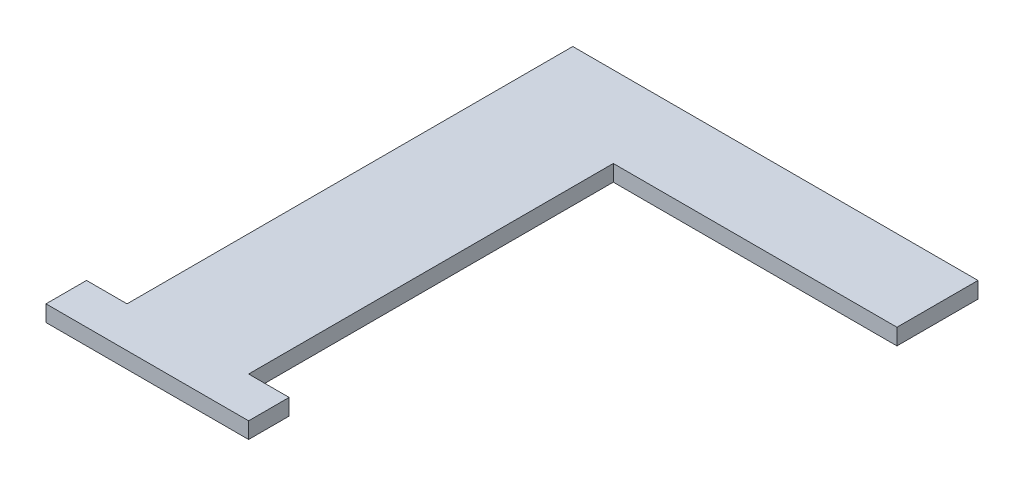
ISO-10303-21;
HEADER;
FILE_DESCRIPTION(('STEP AP214'),'2;1');
FILE_NAME('part.step','',(''),(''),'','','');
FILE_SCHEMA(('AUTOMOTIVE_DESIGN { 1 0 10303 214 1 1 1 1 }'));
ENDSEC;
DATA;
#1=APPLICATION_CONTEXT('core data for automotive mechanical design processes');
#2=APPLICATION_PROTOCOL_DEFINITION('international standard','automotive_design',2000,#1);
#3=PRODUCT_CONTEXT('',#1,'mechanical');
#4=PRODUCT('Part','Part','',(#3));
#5=PRODUCT_RELATED_PRODUCT_CATEGORY('part','',(#4));
#6=PRODUCT_DEFINITION_FORMATION('','',#4);
#7=PRODUCT_DEFINITION_CONTEXT('part definition',#1,'design');
#8=PRODUCT_DEFINITION('design','',#6,#7);
#9=PRODUCT_DEFINITION_SHAPE('','',#8);
#10=(LENGTH_UNIT() NAMED_UNIT(*) SI_UNIT(.MILLI.,.METRE.));
#11=(NAMED_UNIT(*) PLANE_ANGLE_UNIT() SI_UNIT($,.RADIAN.));
#12=(NAMED_UNIT(*) SI_UNIT($,.STERADIAN.) SOLID_ANGLE_UNIT());
#13=UNCERTAINTY_MEASURE_WITH_UNIT(LENGTH_MEASURE(1.E-05),#10,'distance_accuracy_value','');
#14=(GEOMETRIC_REPRESENTATION_CONTEXT(3) GLOBAL_UNCERTAINTY_ASSIGNED_CONTEXT((#13)) GLOBAL_UNIT_ASSIGNED_CONTEXT((#10,
#11,#12)) REPRESENTATION_CONTEXT('',''));
#15=CARTESIAN_POINT('',(0.,0.,0.));
#16=DIRECTION('',(0.,0.,1.));
#17=DIRECTION('',(1.,0.,0.));
#18=AXIS2_PLACEMENT_3D('',#15,#16,#17);
#19=CARTESIAN_POINT('',(0.,2.,10.));
#20=DIRECTION('',(-1.,0.,0.));
#21=DIRECTION('',(0.,0.,1.));
#22=AXIS2_PLACEMENT_3D('',#19,#20,#21);
#23=PLANE('',#22);
#24=DIRECTION('',(0.,0.,-1.));
#25=VECTOR('',#24,1.);
#26=CARTESIAN_POINT('',(0.,0.,10.));
#27=LINE('',#26,#25);
#28=CARTESIAN_POINT('',(0.,0.,10.));
#29=VERTEX_POINT('',#28);
#30=CARTESIAN_POINT('',(0.,0.,0.));
#31=VERTEX_POINT('',#30);
#32=EDGE_CURVE('E152',#29,#31,#27,.T.);
#33=ORIENTED_EDGE('',*,*,#32,.T.);
#34=DIRECTION('',(0.,-1.,0.));
#35=VECTOR('',#34,1.);
#36=CARTESIAN_POINT('',(0.,2.,0.));
#37=LINE('',#36,#35);
#38=CARTESIAN_POINT('',(0.,2.,0.));
#39=VERTEX_POINT('',#38);
#40=EDGE_CURVE('E11',#39,#31,#37,.T.);
#41=ORIENTED_EDGE('',*,*,#40,.F.);
#42=DIRECTION('',(0.,0.,-1.));
#43=VECTOR('',#42,1.);
#44=CARTESIAN_POINT('',(0.,2.,10.));
#45=LINE('',#44,#43);
#46=CARTESIAN_POINT('',(0.,2.,10.));
#47=VERTEX_POINT('',#46);
#48=EDGE_CURVE('E181',#47,#39,#45,.T.);
#49=ORIENTED_EDGE('',*,*,#48,.F.);
#50=DIRECTION('',(0.,-1.,0.));
#51=VECTOR('',#50,1.);
#52=CARTESIAN_POINT('',(0.,2.,10.));
#53=LINE('',#52,#51);
#54=EDGE_CURVE('E148',#47,#29,#53,.T.);
#55=ORIENTED_EDGE('',*,*,#54,.T.);
#56=EDGE_LOOP('',(#33,#41,#49,#55));
#57=FACE_BOUND('',#56,.T.);
#58=ADVANCED_FACE('F39',(#57),#23,.F.);
#59=CARTESIAN_POINT('',(0.,2.,0.));
#60=DIRECTION('',(0.,0.,1.));
#61=DIRECTION('',(1.,0.,0.));
#62=AXIS2_PLACEMENT_3D('',#59,#60,#61);
#63=PLANE('',#62);
#64=DIRECTION('',(-1.,0.,0.));
#65=VECTOR('',#64,1.);
#66=CARTESIAN_POINT('',(0.,0.,0.));
#67=LINE('',#66,#65);
#68=CARTESIAN_POINT('',(-50.,0.,0.));
#69=VERTEX_POINT('',#68);
#70=EDGE_CURVE('E156',#31,#69,#67,.T.);
#71=ORIENTED_EDGE('',*,*,#70,.T.);
#72=DIRECTION('',(0.,-1.,0.));
#73=VECTOR('',#72,1.);
#74=CARTESIAN_POINT('',(-50.,2.,0.));
#75=LINE('',#74,#73);
#76=CARTESIAN_POINT('',(-50.,2.,0.));
#77=VERTEX_POINT('',#76);
#78=EDGE_CURVE('E48',#77,#69,#75,.T.);
#79=ORIENTED_EDGE('',*,*,#78,.F.);
#80=DIRECTION('',(-1.,0.,0.));
#81=VECTOR('',#80,1.);
#82=CARTESIAN_POINT('',(0.,2.,0.));
#83=LINE('',#82,#81);
#84=EDGE_CURVE('E105',#39,#77,#83,.T.);
#85=ORIENTED_EDGE('',*,*,#84,.F.);
#86=ORIENTED_EDGE('',*,*,#40,.T.);
#87=EDGE_LOOP('',(#71,#79,#85,#86));
#88=FACE_BOUND('',#87,.T.);
#89=ADVANCED_FACE('F244',(#88),#63,.F.);
#90=CARTESIAN_POINT('',(-50.,2.,0.));
#91=DIRECTION('',(1.,0.,0.));
#92=DIRECTION('',(0.,0.,-1.));
#93=AXIS2_PLACEMENT_3D('',#90,#91,#92);
#94=PLANE('',#93);
#95=DIRECTION('',(0.,0.,1.));
#96=VECTOR('',#95,1.);
#97=CARTESIAN_POINT('',(-50.,0.,0.));
#98=LINE('',#97,#96);
#99=CARTESIAN_POINT('',(-50.,0.,55.));
#100=VERTEX_POINT('',#99);
#101=EDGE_CURVE('E159',#69,#100,#98,.T.);
#102=ORIENTED_EDGE('',*,*,#101,.T.);
#103=DIRECTION('',(0.,-1.,0.));
#104=VECTOR('',#103,1.);
#105=CARTESIAN_POINT('',(-50.,2.,55.));
#106=LINE('',#105,#104);
#107=CARTESIAN_POINT('',(-50.,2.,55.));
#108=VERTEX_POINT('',#107);
#109=EDGE_CURVE('E200',#108,#100,#106,.T.);
#110=ORIENTED_EDGE('',*,*,#109,.F.);
#111=DIRECTION('',(0.,0.,1.));
#112=VECTOR('',#111,1.);
#113=CARTESIAN_POINT('',(-50.,2.,0.));
#114=LINE('',#113,#112);
#115=EDGE_CURVE('E210',#77,#108,#114,.T.);
#116=ORIENTED_EDGE('',*,*,#115,.F.);
#117=ORIENTED_EDGE('',*,*,#78,.T.);
#118=EDGE_LOOP('',(#102,#110,#116,#117));
#119=FACE_BOUND('',#118,.T.);
#120=ADVANCED_FACE('F208',(#119),#94,.F.);
#121=CARTESIAN_POINT('',(-55.,2.,55.));
#122=DIRECTION('',(0.,0.,1.));
#123=DIRECTION('',(1.,0.,0.));
#124=AXIS2_PLACEMENT_3D('',#121,#122,#123);
#125=PLANE('',#124);
#126=DIRECTION('',(-1.,0.,0.));
#127=VECTOR('',#126,1.);
#128=CARTESIAN_POINT('',(-55.,0.,55.));
#129=LINE('',#128,#127);
#130=CARTESIAN_POINT('',(-55.,0.,55.));
#131=VERTEX_POINT('',#130);
#132=EDGE_CURVE('E162',#100,#131,#129,.T.);
#133=ORIENTED_EDGE('',*,*,#132,.T.);
#134=DIRECTION('',(0.,-1.,0.));
#135=VECTOR('',#134,1.);
#136=CARTESIAN_POINT('',(-55.,2.,55.));
#137=LINE('',#136,#135);
#138=CARTESIAN_POINT('',(-55.,2.,55.));
#139=VERTEX_POINT('',#138);
#140=EDGE_CURVE('E196',#139,#131,#137,.T.);
#141=ORIENTED_EDGE('',*,*,#140,.F.);
#142=DIRECTION('',(-1.,0.,0.));
#143=VECTOR('',#142,1.);
#144=CARTESIAN_POINT('',(-55.,2.,55.));
#145=LINE('',#144,#143);
#146=EDGE_CURVE('E228',#108,#139,#145,.T.);
#147=ORIENTED_EDGE('',*,*,#146,.F.);
#148=ORIENTED_EDGE('',*,*,#109,.T.);
#149=EDGE_LOOP('',(#133,#141,#147,#148));
#150=FACE_BOUND('',#149,.T.);
#151=ADVANCED_FACE('F218',(#150),#125,.F.);
#152=CARTESIAN_POINT('',(-55.,2.,60.));
#153=DIRECTION('',(1.,0.,0.));
#154=DIRECTION('',(0.,0.,-1.));
#155=AXIS2_PLACEMENT_3D('',#152,#153,#154);
#156=PLANE('',#155);
#157=DIRECTION('',(0.,0.,1.));
#158=VECTOR('',#157,1.);
#159=CARTESIAN_POINT('',(-55.,0.,60.));
#160=LINE('',#159,#158);
#161=CARTESIAN_POINT('',(-55.,0.,60.));
#162=VERTEX_POINT('',#161);
#163=EDGE_CURVE('E165',#131,#162,#160,.T.);
#164=ORIENTED_EDGE('',*,*,#163,.T.);
#165=DIRECTION('',(0.,-1.,0.));
#166=VECTOR('',#165,1.);
#167=CARTESIAN_POINT('',(-55.,2.,60.));
#168=LINE('',#167,#166);
#169=CARTESIAN_POINT('',(-55.,2.,60.));
#170=VERTEX_POINT('',#169);
#171=EDGE_CURVE('E192',#170,#162,#168,.T.);
#172=ORIENTED_EDGE('',*,*,#171,.F.);
#173=DIRECTION('',(0.,0.,1.));
#174=VECTOR('',#173,1.);
#175=CARTESIAN_POINT('',(-55.,2.,60.));
#176=LINE('',#175,#174);
#177=EDGE_CURVE('E224',#139,#170,#176,.T.);
#178=ORIENTED_EDGE('',*,*,#177,.F.);
#179=ORIENTED_EDGE('',*,*,#140,.T.);
#180=EDGE_LOOP('',(#164,#172,#178,#179));
#181=FACE_BOUND('',#180,.T.);
#182=ADVANCED_FACE('F222',(#181),#156,.F.);
#183=CARTESIAN_POINT('',(-35.,2.,60.));
#184=DIRECTION('',(0.,0.,-1.));
#185=DIRECTION('',(-1.,0.,0.));
#186=AXIS2_PLACEMENT_3D('',#183,#184,#185);
#187=PLANE('',#186);
#188=DIRECTION('',(1.,0.,0.));
#189=VECTOR('',#188,1.);
#190=CARTESIAN_POINT('',(-35.,0.,60.));
#191=LINE('',#190,#189);
#192=CARTESIAN_POINT('',(-30.,0.,60.));
#193=VERTEX_POINT('',#192);
#194=EDGE_CURVE('E169',#162,#193,#191,.T.);
#195=ORIENTED_EDGE('',*,*,#194,.T.);
#196=DIRECTION('',(0.,-1.,0.));
#197=VECTOR('',#196,1.);
#198=CARTESIAN_POINT('',(-30.,2.,60.));
#199=LINE('',#198,#197);
#200=CARTESIAN_POINT('',(-30.,2.,60.));
#201=VERTEX_POINT('',#200);
#202=EDGE_CURVE('E188',#201,#193,#199,.T.);
#203=ORIENTED_EDGE('',*,*,#202,.F.);
#204=DIRECTION('',(1.,0.,0.));
#205=VECTOR('',#204,1.);
#206=CARTESIAN_POINT('',(-50.,2.,60.));
#207=LINE('',#206,#205);
#208=EDGE_CURVE('E227',#170,#201,#207,.T.);
#209=ORIENTED_EDGE('',*,*,#208,.F.);
#210=ORIENTED_EDGE('',*,*,#171,.T.);
#211=EDGE_LOOP('',(#195,#203,#209,#210));
#212=FACE_BOUND('',#211,.T.);
#213=ADVANCED_FACE('F256',(#212),#187,.F.);
#214=CARTESIAN_POINT('',(-30.,2.,60.));
#215=DIRECTION('',(-1.,0.,0.));
#216=DIRECTION('',(0.,0.,1.));
#217=AXIS2_PLACEMENT_3D('',#214,#215,#216);
#218=PLANE('',#217);
#219=DIRECTION('',(0.,0.,-1.));
#220=VECTOR('',#219,1.);
#221=CARTESIAN_POINT('',(-30.,0.,60.));
#222=LINE('',#221,#220);
#223=CARTESIAN_POINT('',(-30.,0.,55.));
#224=VERTEX_POINT('',#223);
#225=EDGE_CURVE('E172',#193,#224,#222,.T.);
#226=ORIENTED_EDGE('',*,*,#225,.T.);
#227=DIRECTION('',(0.,-1.,0.));
#228=VECTOR('',#227,1.);
#229=CARTESIAN_POINT('',(-30.,2.,55.));
#230=LINE('',#229,#228);
#231=CARTESIAN_POINT('',(-30.,2.,55.));
#232=VERTEX_POINT('',#231);
#233=EDGE_CURVE('E141',#232,#224,#230,.T.);
#234=ORIENTED_EDGE('',*,*,#233,.F.);
#235=DIRECTION('',(0.,0.,-1.));
#236=VECTOR('',#235,1.);
#237=CARTESIAN_POINT('',(-30.,2.,60.));
#238=LINE('',#237,#236);
#239=EDGE_CURVE('E130',#201,#232,#238,.T.);
#240=ORIENTED_EDGE('',*,*,#239,.F.);
#241=ORIENTED_EDGE('',*,*,#202,.T.);
#242=EDGE_LOOP('',(#226,#234,#240,#241));
#243=FACE_BOUND('',#242,.T.);
#244=ADVANCED_FACE('F259',(#243),#218,.F.);
#245=CARTESIAN_POINT('',(-30.,2.,55.));
#246=DIRECTION('',(0.,0.,1.));
#247=DIRECTION('',(1.,0.,0.));
#248=AXIS2_PLACEMENT_3D('',#245,#246,#247);
#249=PLANE('',#248);
#250=DIRECTION('',(-1.,0.,0.));
#251=VECTOR('',#250,1.);
#252=CARTESIAN_POINT('',(-30.,0.,55.));
#253=LINE('',#252,#251);
#254=CARTESIAN_POINT('',(-35.,0.,55.));
#255=VERTEX_POINT('',#254);
#256=EDGE_CURVE('E139',#224,#255,#253,.T.);
#257=ORIENTED_EDGE('',*,*,#256,.T.);
#258=DIRECTION('',(0.,-1.,0.));
#259=VECTOR('',#258,1.);
#260=CARTESIAN_POINT('',(-35.,2.,55.));
#261=LINE('',#260,#259);
#262=CARTESIAN_POINT('',(-35.,2.,55.));
#263=VERTEX_POINT('',#262);
#264=EDGE_CURVE('E136',#263,#255,#261,.T.);
#265=ORIENTED_EDGE('',*,*,#264,.F.);
#266=DIRECTION('',(-1.,0.,0.));
#267=VECTOR('',#266,1.);
#268=CARTESIAN_POINT('',(-30.,2.,55.));
#269=LINE('',#268,#267);
#270=EDGE_CURVE('E124',#232,#263,#269,.T.);
#271=ORIENTED_EDGE('',*,*,#270,.F.);
#272=ORIENTED_EDGE('',*,*,#233,.T.);
#273=EDGE_LOOP('',(#257,#265,#271,#272));
#274=FACE_BOUND('',#273,.T.);
#275=ADVANCED_FACE('F137',(#274),#249,.F.);
#276=CARTESIAN_POINT('',(-35.,2.,55.));
#277=DIRECTION('',(-1.,0.,0.));
#278=DIRECTION('',(0.,0.,1.));
#279=AXIS2_PLACEMENT_3D('',#276,#277,#278);
#280=PLANE('',#279);
#281=DIRECTION('',(0.,0.,-1.));
#282=VECTOR('',#281,1.);
#283=CARTESIAN_POINT('',(-35.,0.,55.));
#284=LINE('',#283,#282);
#285=CARTESIAN_POINT('',(-35.,0.,10.));
#286=VERTEX_POINT('',#285);
#287=EDGE_CURVE('E91',#255,#286,#284,.T.);
#288=ORIENTED_EDGE('',*,*,#287,.T.);
#289=DIRECTION('',(0.,-1.,0.));
#290=VECTOR('',#289,1.);
#291=CARTESIAN_POINT('',(-35.,2.,10.));
#292=LINE('',#291,#290);
#293=CARTESIAN_POINT('',(-35.,2.,10.));
#294=VERTEX_POINT('',#293);
#295=EDGE_CURVE('E142',#294,#286,#292,.T.);
#296=ORIENTED_EDGE('',*,*,#295,.F.);
#297=DIRECTION('',(0.,0.,-1.));
#298=VECTOR('',#297,1.);
#299=CARTESIAN_POINT('',(-35.,2.,55.));
#300=LINE('',#299,#298);
#301=EDGE_CURVE('E128',#263,#294,#300,.T.);
#302=ORIENTED_EDGE('',*,*,#301,.F.);
#303=ORIENTED_EDGE('',*,*,#264,.T.);
#304=EDGE_LOOP('',(#288,#296,#302,#303));
#305=FACE_BOUND('',#304,.T.);
#306=ADVANCED_FACE('F144',(#305),#280,.F.);
#307=CARTESIAN_POINT('',(-35.,2.,10.));
#308=DIRECTION('',(0.,0.,-1.));
#309=DIRECTION('',(-1.,0.,0.));
#310=AXIS2_PLACEMENT_3D('',#307,#308,#309);
#311=PLANE('',#310);
#312=DIRECTION('',(1.,0.,0.));
#313=VECTOR('',#312,1.);
#314=CARTESIAN_POINT('',(-35.,0.,10.));
#315=LINE('',#314,#313);
#316=EDGE_CURVE('E97',#286,#29,#315,.T.);
#317=ORIENTED_EDGE('',*,*,#316,.T.);
#318=ORIENTED_EDGE('',*,*,#54,.F.);
#319=DIRECTION('',(1.,0.,0.));
#320=VECTOR('',#319,1.);
#321=CARTESIAN_POINT('',(-35.,2.,10.));
#322=LINE('',#321,#320);
#323=EDGE_CURVE('E56',#294,#47,#322,.T.);
#324=ORIENTED_EDGE('',*,*,#323,.F.);
#325=ORIENTED_EDGE('',*,*,#295,.T.);
#326=EDGE_LOOP('',(#317,#318,#324,#325));
#327=FACE_BOUND('',#326,.T.);
#328=ADVANCED_FACE('F268',(#327),#311,.F.);
#329=CARTESIAN_POINT('',(0.,2.,0.));
#330=DIRECTION('',(0.,1.,0.));
#331=DIRECTION('',(0.,0.,1.));
#332=AXIS2_PLACEMENT_3D('',#329,#330,#331);
#333=PLANE('',#332);
#334=ORIENTED_EDGE('',*,*,#48,.T.);
#335=ORIENTED_EDGE('',*,*,#84,.T.);
#336=ORIENTED_EDGE('',*,*,#115,.T.);
#337=ORIENTED_EDGE('',*,*,#146,.T.);
#338=ORIENTED_EDGE('',*,*,#177,.T.);
#339=ORIENTED_EDGE('',*,*,#208,.T.);
#340=ORIENTED_EDGE('',*,*,#239,.T.);
#341=ORIENTED_EDGE('',*,*,#270,.T.);
#342=ORIENTED_EDGE('',*,*,#301,.T.);
#343=ORIENTED_EDGE('',*,*,#323,.T.);
#344=EDGE_LOOP('',(#334,#335,#336,#337,#338,#339,#340,#341,#342,#343));
#345=FACE_BOUND('',#344,.T.);
#346=ADVANCED_FACE('F126',(#345),#333,.T.);
#347=CARTESIAN_POINT('',(0.,0.,0.));
#348=DIRECTION('',(0.,1.,0.));
#349=DIRECTION('',(0.,0.,1.));
#350=AXIS2_PLACEMENT_3D('',#347,#348,#349);
#351=PLANE('',#350);
#352=ORIENTED_EDGE('',*,*,#32,.F.);
#353=ORIENTED_EDGE('',*,*,#316,.F.);
#354=ORIENTED_EDGE('',*,*,#287,.F.);
#355=ORIENTED_EDGE('',*,*,#256,.F.);
#356=ORIENTED_EDGE('',*,*,#225,.F.);
#357=ORIENTED_EDGE('',*,*,#194,.F.);
#358=ORIENTED_EDGE('',*,*,#163,.F.);
#359=ORIENTED_EDGE('',*,*,#132,.F.);
#360=ORIENTED_EDGE('',*,*,#101,.F.);
#361=ORIENTED_EDGE('',*,*,#70,.F.);
#362=EDGE_LOOP('',(#352,#353,#354,#355,#356,#357,#358,#359,#360,#361));
#363=FACE_BOUND('',#362,.T.);
#364=ADVANCED_FACE('F214',(#363),#351,.F.);
#365=CLOSED_SHELL('',(#58,#89,#120,#151,#182,#213,#244,#275,#306,#328,#346,#364));
#366=MANIFOLD_SOLID_BREP('B2',#365);
#367=ADVANCED_BREP_SHAPE_REPRESENTATION('',(#18,#366),#14);
#368=SHAPE_DEFINITION_REPRESENTATION(#9,#367);
ENDSEC;
END-ISO-10303-21;
